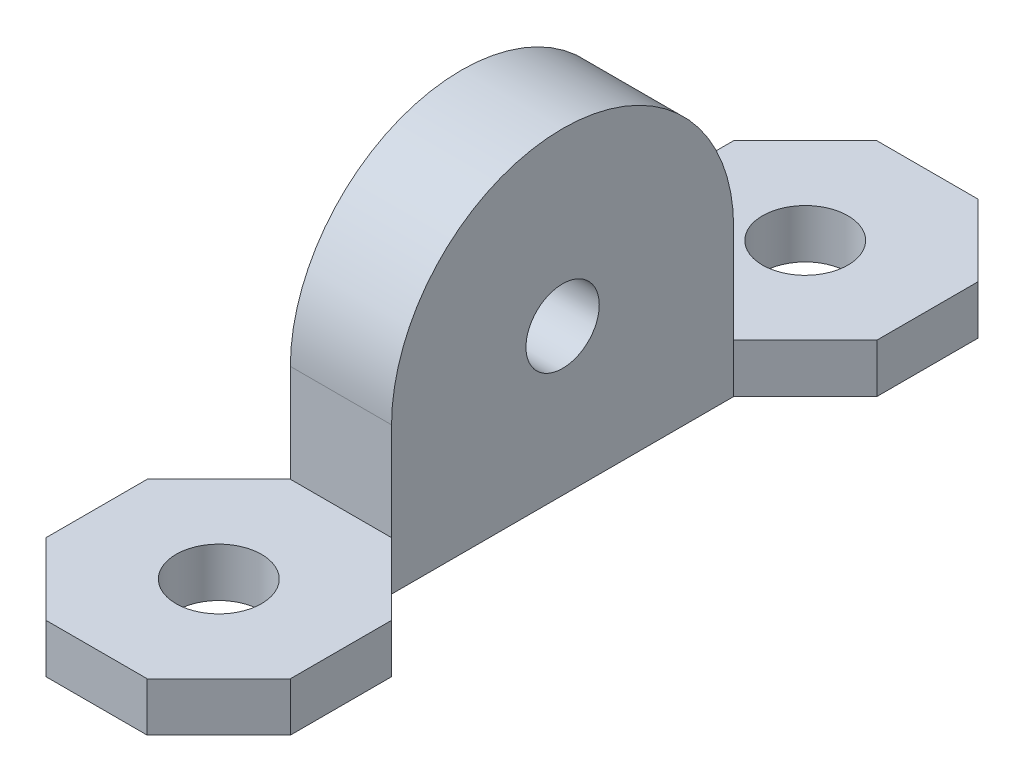
ISO-10303-21;
HEADER;
FILE_DESCRIPTION(('STEP AP214'),'2;1');
FILE_NAME('part.step','',(''),(''),'','','');
FILE_SCHEMA(('AUTOMOTIVE_DESIGN { 1 0 10303 214 1 1 1 1 }'));
ENDSEC;
DATA;
#1=APPLICATION_CONTEXT('core data for automotive mechanical design processes');
#2=APPLICATION_PROTOCOL_DEFINITION('international standard','automotive_design',2000,#1);
#3=PRODUCT_CONTEXT('',#1,'mechanical');
#4=PRODUCT('Part','Part','',(#3));
#5=PRODUCT_RELATED_PRODUCT_CATEGORY('part','',(#4));
#6=PRODUCT_DEFINITION_FORMATION('','',#4);
#7=PRODUCT_DEFINITION_CONTEXT('part definition',#1,'design');
#8=PRODUCT_DEFINITION('design','',#6,#7);
#9=PRODUCT_DEFINITION_SHAPE('','',#8);
#10=(LENGTH_UNIT() NAMED_UNIT(*) SI_UNIT(.MILLI.,.METRE.));
#11=(NAMED_UNIT(*) PLANE_ANGLE_UNIT() SI_UNIT($,.RADIAN.));
#12=(NAMED_UNIT(*) SI_UNIT($,.STERADIAN.) SOLID_ANGLE_UNIT());
#13=UNCERTAINTY_MEASURE_WITH_UNIT(LENGTH_MEASURE(1.E-05),#10,'distance_accuracy_value','');
#14=(GEOMETRIC_REPRESENTATION_CONTEXT(3) GLOBAL_UNCERTAINTY_ASSIGNED_CONTEXT((#13)) GLOBAL_UNIT_ASSIGNED_CONTEXT((#10,
#11,#12)) REPRESENTATION_CONTEXT('',''));
#15=CARTESIAN_POINT('',(0.,0.,0.));
#16=DIRECTION('',(0.,0.,1.));
#17=DIRECTION('',(1.,0.,0.));
#18=AXIS2_PLACEMENT_3D('',#15,#16,#17);
#19=CARTESIAN_POINT('',(0.,2.,0.));
#20=DIRECTION('',(0.,1.,0.));
#21=DIRECTION('',(0.,0.,1.));
#22=AXIS2_PLACEMENT_3D('',#19,#20,#21);
#23=PLANE('',#22);
#24=CARTESIAN_POINT('',(-0.275775290324268,2.,15.722972972973));
#25=DIRECTION('',(0.,1.,0.));
#26=DIRECTION('',(0.,0.,1.));
#27=AXIS2_PLACEMENT_3D('',#24,#25,#26);
#28=CIRCLE('',#27,1.75);
#29=CARTESIAN_POINT('',(-0.275775290324268,2.,17.472972972973));
#30=VERTEX_POINT('',#29);
#31=EDGE_CURVE('E360',#30,#30,#28,.T.);
#32=ORIENTED_EDGE('',*,*,#31,.F.);
#33=EDGE_LOOP('',(#32));
#34=FACE_BOUND('',#33,.T.);
#35=DIRECTION('',(-0.707106781186548,0.,-0.707106781186547));
#36=VECTOR('',#35,1.);
#37=CARTESIAN_POINT('',(4.72422470967573,2.,13.6519051611075));
#38=LINE('',#37,#36);
#39=CARTESIAN_POINT('',(4.72422470967573,2.,13.6519051611075));
#40=VERTEX_POINT('',#39);
#41=CARTESIAN_POINT('',(1.79529252154121,2.,10.722972972973));
#42=VERTEX_POINT('',#41);
#43=EDGE_CURVE('E186',#40,#42,#38,.T.);
#44=ORIENTED_EDGE('',*,*,#43,.T.);
#45=DIRECTION('',(-1.,0.,0.));
#46=VECTOR('',#45,1.);
#47=CARTESIAN_POINT('',(0.,2.,10.722972972973));
#48=LINE('',#47,#46);
#49=CARTESIAN_POINT('',(-2.34684310218974,2.,10.722972972973));
#50=VERTEX_POINT('',#49);
#51=EDGE_CURVE('E169',#42,#50,#48,.T.);
#52=ORIENTED_EDGE('',*,*,#51,.T.);
#53=DIRECTION('',(-0.707106781186548,0.,0.707106781186548));
#54=VECTOR('',#53,1.);
#55=CARTESIAN_POINT('',(-2.34684310218974,2.,10.722972972973));
#56=LINE('',#55,#54);
#57=CARTESIAN_POINT('',(-5.27577529032427,2.,13.6519051611075));
#58=VERTEX_POINT('',#57);
#59=EDGE_CURVE('E216',#50,#58,#56,.T.);
#60=ORIENTED_EDGE('',*,*,#59,.T.);
#61=DIRECTION('',(0.,0.,1.));
#62=VECTOR('',#61,1.);
#63=CARTESIAN_POINT('',(-5.27577529032427,2.,13.6519051611075));
#64=LINE('',#63,#62);
#65=CARTESIAN_POINT('',(-5.27577529032427,2.,17.7940407848384));
#66=VERTEX_POINT('',#65);
#67=EDGE_CURVE('E218',#58,#66,#64,.T.);
#68=ORIENTED_EDGE('',*,*,#67,.T.);
#69=DIRECTION('',(0.707106781186548,0.,0.707106781186547));
#70=VECTOR('',#69,1.);
#71=CARTESIAN_POINT('',(-5.27577529032427,2.,17.7940407848384));
#72=LINE('',#71,#70);
#73=CARTESIAN_POINT('',(-2.34684310218974,2.,20.722972972973));
#74=VERTEX_POINT('',#73);
#75=EDGE_CURVE('E220',#66,#74,#72,.T.);
#76=ORIENTED_EDGE('',*,*,#75,.T.);
#77=DIRECTION('',(1.,0.,0.));
#78=VECTOR('',#77,1.);
#79=CARTESIAN_POINT('',(-2.34684310218974,2.,20.722972972973));
#80=LINE('',#79,#78);
#81=CARTESIAN_POINT('',(1.79529252154121,2.,20.722972972973));
#82=VERTEX_POINT('',#81);
#83=EDGE_CURVE('E222',#74,#82,#80,.T.);
#84=ORIENTED_EDGE('',*,*,#83,.T.);
#85=DIRECTION('',(0.707106781186548,0.,-0.707106781186548));
#86=VECTOR('',#85,1.);
#87=CARTESIAN_POINT('',(1.79529252154121,2.,20.722972972973));
#88=LINE('',#87,#86);
#89=CARTESIAN_POINT('',(4.72422470967573,2.,17.7940407848384));
#90=VERTEX_POINT('',#89);
#91=EDGE_CURVE('E224',#82,#90,#88,.T.);
#92=ORIENTED_EDGE('',*,*,#91,.T.);
#93=DIRECTION('',(0.,0.,-1.));
#94=VECTOR('',#93,1.);
#95=CARTESIAN_POINT('',(4.72422470967573,2.,17.7940407848384));
#96=LINE('',#95,#94);
#97=EDGE_CURVE('E226',#90,#40,#96,.T.);
#98=ORIENTED_EDGE('',*,*,#97,.T.);
#99=EDGE_LOOP('',(#44,#52,#60,#68,#76,#84,#92,#98));
#100=FACE_BOUND('',#99,.T.);
#101=ADVANCED_FACE('F36',(#34,#100),#23,.T.);
#102=CARTESIAN_POINT('',(-0.275775290324269,2.,-8.27702702702704));
#103=DIRECTION('',(0.,1.,0.));
#104=DIRECTION('',(0.,0.,1.));
#105=AXIS2_PLACEMENT_3D('',#102,#103,#104);
#106=CIRCLE('',#105,1.75);
#107=CARTESIAN_POINT('',(-0.275775290324269,2.,-6.52702702702704));
#108=VERTEX_POINT('',#107);
#109=EDGE_CURVE('E354',#108,#108,#106,.T.);
#110=ORIENTED_EDGE('',*,*,#109,.F.);
#111=EDGE_LOOP('',(#110));
#112=FACE_BOUND('',#111,.T.);
#113=DIRECTION('',(0.707106781186548,0.,0.707106781186548));
#114=VECTOR('',#113,1.);
#115=CARTESIAN_POINT('',(-5.27577529032427,2.,-6.20595921516157));
#116=LINE('',#115,#114);
#117=CARTESIAN_POINT('',(-5.27577529032427,2.,-6.20595921516157));
#118=VERTEX_POINT('',#117);
#119=CARTESIAN_POINT('',(-2.34684310218974,2.,-3.27702702702704));
#120=VERTEX_POINT('',#119);
#121=EDGE_CURVE('E163',#118,#120,#116,.T.);
#122=ORIENTED_EDGE('',*,*,#121,.T.);
#123=DIRECTION('',(1.,0.,0.));
#124=VECTOR('',#123,1.);
#125=CARTESIAN_POINT('',(0.,2.,-3.27702702702704));
#126=LINE('',#125,#124);
#127=CARTESIAN_POINT('',(1.79529252154121,2.,-3.27702702702704));
#128=VERTEX_POINT('',#127);
#129=EDGE_CURVE('E157',#120,#128,#126,.T.);
#130=ORIENTED_EDGE('',*,*,#129,.T.);
#131=DIRECTION('',(0.707106781186547,0.,-0.707106781186548));
#132=VECTOR('',#131,1.);
#133=CARTESIAN_POINT('',(1.79529252154121,2.,-3.27702702702704));
#134=LINE('',#133,#132);
#135=CARTESIAN_POINT('',(4.72422470967573,2.,-6.20595921516157));
#136=VERTEX_POINT('',#135);
#137=EDGE_CURVE('E161',#128,#136,#134,.T.);
#138=ORIENTED_EDGE('',*,*,#137,.T.);
#139=DIRECTION('',(0.,0.,-1.));
#140=VECTOR('',#139,1.);
#141=CARTESIAN_POINT('',(4.72422470967573,2.,-6.20595921516157));
#142=LINE('',#141,#140);
#143=CARTESIAN_POINT('',(4.72422470967573,2.,-10.3480948388925));
#144=VERTEX_POINT('',#143);
#145=EDGE_CURVE('E53',#136,#144,#142,.T.);
#146=ORIENTED_EDGE('',*,*,#145,.T.);
#147=DIRECTION('',(-0.707106781186548,0.,-0.707106781186548));
#148=VECTOR('',#147,1.);
#149=CARTESIAN_POINT('',(4.72422470967573,2.,-10.3480948388925));
#150=LINE('',#149,#148);
#151=CARTESIAN_POINT('',(1.79529252154121,2.,-13.277027027027));
#152=VERTEX_POINT('',#151);
#153=EDGE_CURVE('E208',#144,#152,#150,.T.);
#154=ORIENTED_EDGE('',*,*,#153,.T.);
#155=DIRECTION('',(-1.,0.,0.));
#156=VECTOR('',#155,1.);
#157=CARTESIAN_POINT('',(1.79529252154121,2.,-13.277027027027));
#158=LINE('',#157,#156);
#159=CARTESIAN_POINT('',(-2.34684310218974,2.,-13.277027027027));
#160=VERTEX_POINT('',#159);
#161=EDGE_CURVE('E121',#152,#160,#158,.T.);
#162=ORIENTED_EDGE('',*,*,#161,.T.);
#163=DIRECTION('',(-0.707106781186547,0.,0.707106781186548));
#164=VECTOR('',#163,1.);
#165=CARTESIAN_POINT('',(-2.34684310218974,2.,-13.277027027027));
#166=LINE('',#165,#164);
#167=CARTESIAN_POINT('',(-5.27577529032427,2.,-10.3480948388925));
#168=VERTEX_POINT('',#167);
#169=EDGE_CURVE('E211',#160,#168,#166,.T.);
#170=ORIENTED_EDGE('',*,*,#169,.T.);
#171=DIRECTION('',(0.,0.,1.));
#172=VECTOR('',#171,1.);
#173=CARTESIAN_POINT('',(-5.27577529032427,2.,-10.3480948388925));
#174=LINE('',#173,#172);
#175=EDGE_CURVE('E213',#168,#118,#174,.T.);
#176=ORIENTED_EDGE('',*,*,#175,.T.);
#177=EDGE_LOOP('',(#122,#130,#138,#146,#154,#162,#170,#176));
#178=FACE_BOUND('',#177,.T.);
#179=ADVANCED_FACE('F159',(#112,#178),#23,.T.);
#180=CARTESIAN_POINT('',(4.72422470967573,2.,-10.3480948388925));
#181=DIRECTION('',(-0.707106781186547,0.,0.707106781186548));
#182=DIRECTION('',(0.707106781186548,0.,0.707106781186547));
#183=AXIS2_PLACEMENT_3D('',#180,#181,#182);
#184=PLANE('',#183);
#185=DIRECTION('',(-0.707106781186548,0.,-0.707106781186548));
#186=VECTOR('',#185,1.);
#187=CARTESIAN_POINT('',(4.72422470967573,0.,-10.3480948388925));
#188=LINE('',#187,#186);
#189=CARTESIAN_POINT('',(4.72422470967573,0.,-10.3480948388925));
#190=VERTEX_POINT('',#189);
#191=CARTESIAN_POINT('',(1.79529252154121,0.,-13.277027027027));
#192=VERTEX_POINT('',#191);
#193=EDGE_CURVE('E207',#190,#192,#188,.T.);
#194=ORIENTED_EDGE('',*,*,#193,.T.);
#195=DIRECTION('',(0.,-1.,0.));
#196=VECTOR('',#195,1.);
#197=CARTESIAN_POINT('',(1.79529252154121,2.,-13.277027027027));
#198=LINE('',#197,#196);
#199=EDGE_CURVE('E11',#152,#192,#198,.T.);
#200=ORIENTED_EDGE('',*,*,#199,.F.);
#201=ORIENTED_EDGE('',*,*,#153,.F.);
#202=DIRECTION('',(0.,-1.,0.));
#203=VECTOR('',#202,1.);
#204=CARTESIAN_POINT('',(4.72422470967573,2.,-10.3480948388925));
#205=LINE('',#204,#203);
#206=EDGE_CURVE('E230',#144,#190,#205,.T.);
#207=ORIENTED_EDGE('',*,*,#206,.T.);
#208=EDGE_LOOP('',(#194,#200,#201,#207));
#209=FACE_BOUND('',#208,.T.);
#210=ADVANCED_FACE('F38',(#209),#184,.F.);
#211=CARTESIAN_POINT('',(1.79529252154121,2.,-13.277027027027));
#212=DIRECTION('',(0.,0.,1.));
#213=DIRECTION('',(1.,0.,0.));
#214=AXIS2_PLACEMENT_3D('',#211,#212,#213);
#215=PLANE('',#214);
#216=DIRECTION('',(-1.,0.,0.));
#217=VECTOR('',#216,1.);
#218=CARTESIAN_POINT('',(1.79529252154121,0.,-13.277027027027));
#219=LINE('',#218,#217);
#220=CARTESIAN_POINT('',(-2.34684310218974,0.,-13.277027027027));
#221=VERTEX_POINT('',#220);
#222=EDGE_CURVE('E233',#192,#221,#219,.T.);
#223=ORIENTED_EDGE('',*,*,#222,.T.);
#224=DIRECTION('',(0.,-1.,0.));
#225=VECTOR('',#224,1.);
#226=CARTESIAN_POINT('',(-2.34684310218974,2.,-13.277027027027));
#227=LINE('',#226,#225);
#228=EDGE_CURVE('E45',#160,#221,#227,.T.);
#229=ORIENTED_EDGE('',*,*,#228,.F.);
#230=ORIENTED_EDGE('',*,*,#161,.F.);
#231=ORIENTED_EDGE('',*,*,#199,.T.);
#232=EDGE_LOOP('',(#223,#229,#230,#231));
#233=FACE_BOUND('',#232,.T.);
#234=ADVANCED_FACE('F426',(#233),#215,.F.);
#235=CARTESIAN_POINT('',(-2.34684310218974,2.,-13.277027027027));
#236=DIRECTION('',(0.707106781186548,0.,0.707106781186547));
#237=DIRECTION('',(0.707106781186547,0.,-0.707106781186548));
#238=AXIS2_PLACEMENT_3D('',#235,#236,#237);
#239=PLANE('',#238);
#240=DIRECTION('',(-0.707106781186547,0.,0.707106781186548));
#241=VECTOR('',#240,1.);
#242=CARTESIAN_POINT('',(-2.34684310218974,0.,-13.277027027027));
#243=LINE('',#242,#241);
#244=CARTESIAN_POINT('',(-5.27577529032427,0.,-10.3480948388925));
#245=VERTEX_POINT('',#244);
#246=EDGE_CURVE('E235',#221,#245,#243,.T.);
#247=ORIENTED_EDGE('',*,*,#246,.T.);
#248=DIRECTION('',(0.,-1.,0.));
#249=VECTOR('',#248,1.);
#250=CARTESIAN_POINT('',(-5.27577529032427,2.,-10.3480948388925));
#251=LINE('',#250,#249);
#252=EDGE_CURVE('E290',#168,#245,#251,.T.);
#253=ORIENTED_EDGE('',*,*,#252,.F.);
#254=ORIENTED_EDGE('',*,*,#169,.F.);
#255=ORIENTED_EDGE('',*,*,#228,.T.);
#256=EDGE_LOOP('',(#247,#253,#254,#255));
#257=FACE_BOUND('',#256,.T.);
#258=ADVANCED_FACE('F296',(#257),#239,.F.);
#259=CARTESIAN_POINT('',(-5.27577529032427,2.,-10.3480948388925));
#260=DIRECTION('',(1.,0.,0.));
#261=DIRECTION('',(0.,0.,-1.));
#262=AXIS2_PLACEMENT_3D('',#259,#260,#261);
#263=PLANE('',#262);
#264=DIRECTION('',(0.,0.,1.));
#265=VECTOR('',#264,1.);
#266=CARTESIAN_POINT('',(-5.27577529032427,0.,-10.3480948388925));
#267=LINE('',#266,#265);
#268=CARTESIAN_POINT('',(-5.27577529032427,0.,-6.20595921516157));
#269=VERTEX_POINT('',#268);
#270=EDGE_CURVE('E237',#245,#269,#267,.T.);
#271=ORIENTED_EDGE('',*,*,#270,.T.);
#272=DIRECTION('',(0.,-1.,0.));
#273=VECTOR('',#272,1.);
#274=CARTESIAN_POINT('',(-5.27577529032427,2.,-6.20595921516157));
#275=LINE('',#274,#273);
#276=EDGE_CURVE('E287',#118,#269,#275,.T.);
#277=ORIENTED_EDGE('',*,*,#276,.F.);
#278=ORIENTED_EDGE('',*,*,#175,.F.);
#279=ORIENTED_EDGE('',*,*,#252,.T.);
#280=EDGE_LOOP('',(#271,#277,#278,#279));
#281=FACE_BOUND('',#280,.T.);
#282=ADVANCED_FACE('F306',(#281),#263,.F.);
#283=CARTESIAN_POINT('',(-5.27577529032427,2.,-6.20595921516157));
#284=DIRECTION('',(0.707106781186547,0.,-0.707106781186548));
#285=DIRECTION('',(-0.707106781186548,0.,-0.707106781186547));
#286=AXIS2_PLACEMENT_3D('',#283,#284,#285);
#287=PLANE('',#286);
#288=DIRECTION('',(0.707106781186548,0.,0.707106781186548));
#289=VECTOR('',#288,1.);
#290=CARTESIAN_POINT('',(-5.27577529032427,0.,-6.20595921516157));
#291=LINE('',#290,#289);
#292=CARTESIAN_POINT('',(-2.34684310218974,0.,-3.27702702702704));
#293=VERTEX_POINT('',#292);
#294=EDGE_CURVE('E239',#269,#293,#291,.T.);
#295=ORIENTED_EDGE('',*,*,#294,.T.);
#296=DIRECTION('',(0.,-1.,0.));
#297=VECTOR('',#296,1.);
#298=CARTESIAN_POINT('',(-2.34684310218974,2.,-3.27702702702704));
#299=LINE('',#298,#297);
#300=EDGE_CURVE('E284',#120,#293,#299,.T.);
#301=ORIENTED_EDGE('',*,*,#300,.F.);
#302=ORIENTED_EDGE('',*,*,#121,.F.);
#303=ORIENTED_EDGE('',*,*,#276,.T.);
#304=EDGE_LOOP('',(#295,#301,#302,#303));
#305=FACE_BOUND('',#304,.T.);
#306=ADVANCED_FACE('F309',(#305),#287,.F.);
#307=CARTESIAN_POINT('',(-2.34684310218974,2.,-3.27702702702704));
#308=DIRECTION('',(1.,0.,0.));
#309=DIRECTION('',(0.,0.,-1.));
#310=AXIS2_PLACEMENT_3D('',#307,#308,#309);
#311=PLANE('',#310);
#312=CARTESIAN_POINT('',(-2.34684310218974,6.,3.72297297297296));
#313=DIRECTION('',(1.,0.,0.));
#314=DIRECTION('',(0.,0.,-1.));
#315=AXIS2_PLACEMENT_3D('',#312,#313,#314);
#316=CIRCLE('',#315,1.5);
#317=CARTESIAN_POINT('',(-2.34684310218974,6.,2.22297297297296));
#318=VERTEX_POINT('',#317);
#319=EDGE_CURVE('E345',#318,#318,#316,.T.);
#320=ORIENTED_EDGE('',*,*,#319,.T.);
#321=EDGE_LOOP('',(#320));
#322=FACE_BOUND('',#321,.T.);
#323=DIRECTION('',(0.,0.,1.));
#324=VECTOR('',#323,1.);
#325=CARTESIAN_POINT('',(-2.34684310218974,0.,-3.27702702702704));
#326=LINE('',#325,#324);
#327=CARTESIAN_POINT('',(-2.34684310218974,0.,10.722972972973));
#328=VERTEX_POINT('',#327);
#329=EDGE_CURVE('E241',#293,#328,#326,.T.);
#330=ORIENTED_EDGE('',*,*,#329,.T.);
#331=DIRECTION('',(0.,-1.,0.));
#332=VECTOR('',#331,1.);
#333=CARTESIAN_POINT('',(-2.34684310218974,2.,10.722972972973));
#334=LINE('',#333,#332);
#335=EDGE_CURVE('E281',#50,#328,#334,.T.);
#336=ORIENTED_EDGE('',*,*,#335,.F.);
#337=DIRECTION('',(0.,1.,0.));
#338=VECTOR('',#337,1.);
#339=CARTESIAN_POINT('',(-2.34684310218974,0.,10.722972972973));
#340=LINE('',#339,#338);
#341=CARTESIAN_POINT('',(-2.34684310218974,6.,10.722972972973));
#342=VERTEX_POINT('',#341);
#343=EDGE_CURVE('E332',#50,#342,#340,.T.);
#344=ORIENTED_EDGE('',*,*,#343,.T.);
#345=CARTESIAN_POINT('',(-2.34684310218974,6.,3.72297297297296));
#346=DIRECTION('',(1.,0.,0.));
#347=DIRECTION('',(0.,0.,-1.));
#348=AXIS2_PLACEMENT_3D('',#345,#346,#347);
#349=CIRCLE('',#348,7.);
#350=CARTESIAN_POINT('',(-2.34684310218974,6.,-3.27702702702704));
#351=VERTEX_POINT('',#350);
#352=EDGE_CURVE('E335',#342,#351,#349,.F.);
#353=ORIENTED_EDGE('',*,*,#352,.T.);
#354=DIRECTION('',(0.,-1.,0.));
#355=VECTOR('',#354,1.);
#356=CARTESIAN_POINT('',(-2.34684310218974,6.,-3.27702702702704));
#357=LINE('',#356,#355);
#358=EDGE_CURVE('E201',#351,#120,#357,.T.);
#359=ORIENTED_EDGE('',*,*,#358,.T.);
#360=ORIENTED_EDGE('',*,*,#300,.T.);
#361=EDGE_LOOP('',(#330,#336,#344,#353,#359,#360));
#362=FACE_BOUND('',#361,.T.);
#363=ADVANCED_FACE('F311',(#322,#362),#311,.F.);
#364=CARTESIAN_POINT('',(-2.34684310218974,2.,10.722972972973));
#365=DIRECTION('',(0.707106781186547,0.,0.707106781186548));
#366=DIRECTION('',(0.707106781186548,0.,-0.707106781186547));
#367=AXIS2_PLACEMENT_3D('',#364,#365,#366);
#368=PLANE('',#367);
#369=DIRECTION('',(-0.707106781186548,0.,0.707106781186548));
#370=VECTOR('',#369,1.);
#371=CARTESIAN_POINT('',(-2.34684310218974,0.,10.722972972973));
#372=LINE('',#371,#370);
#373=CARTESIAN_POINT('',(-5.27577529032427,0.,13.6519051611075));
#374=VERTEX_POINT('',#373);
#375=EDGE_CURVE('E243',#328,#374,#372,.T.);
#376=ORIENTED_EDGE('',*,*,#375,.T.);
#377=DIRECTION('',(0.,-1.,0.));
#378=VECTOR('',#377,1.);
#379=CARTESIAN_POINT('',(-5.27577529032427,2.,13.6519051611075));
#380=LINE('',#379,#378);
#381=EDGE_CURVE('E278',#58,#374,#380,.T.);
#382=ORIENTED_EDGE('',*,*,#381,.F.);
#383=ORIENTED_EDGE('',*,*,#59,.F.);
#384=ORIENTED_EDGE('',*,*,#335,.T.);
#385=EDGE_LOOP('',(#376,#382,#383,#384));
#386=FACE_BOUND('',#385,.T.);
#387=ADVANCED_FACE('F319',(#386),#368,.F.);
#388=CARTESIAN_POINT('',(-5.27577529032427,2.,13.6519051611075));
#389=DIRECTION('',(1.,0.,0.));
#390=DIRECTION('',(0.,0.,-1.));
#391=AXIS2_PLACEMENT_3D('',#388,#389,#390);
#392=PLANE('',#391);
#393=DIRECTION('',(0.,0.,1.));
#394=VECTOR('',#393,1.);
#395=CARTESIAN_POINT('',(-5.27577529032427,0.,13.6519051611075));
#396=LINE('',#395,#394);
#397=CARTESIAN_POINT('',(-5.27577529032427,0.,17.7940407848384));
#398=VERTEX_POINT('',#397);
#399=EDGE_CURVE('E245',#374,#398,#396,.T.);
#400=ORIENTED_EDGE('',*,*,#399,.T.);
#401=DIRECTION('',(0.,-1.,0.));
#402=VECTOR('',#401,1.);
#403=CARTESIAN_POINT('',(-5.27577529032427,2.,17.7940407848384));
#404=LINE('',#403,#402);
#405=EDGE_CURVE('E275',#66,#398,#404,.T.);
#406=ORIENTED_EDGE('',*,*,#405,.F.);
#407=ORIENTED_EDGE('',*,*,#67,.F.);
#408=ORIENTED_EDGE('',*,*,#381,.T.);
#409=EDGE_LOOP('',(#400,#406,#407,#408));
#410=FACE_BOUND('',#409,.T.);
#411=ADVANCED_FACE('F323',(#410),#392,.F.);
#412=CARTESIAN_POINT('',(-5.27577529032427,2.,17.7940407848384));
#413=DIRECTION('',(0.707106781186547,0.,-0.707106781186548));
#414=DIRECTION('',(-0.707106781186548,0.,-0.707106781186547));
#415=AXIS2_PLACEMENT_3D('',#412,#413,#414);
#416=PLANE('',#415);
#417=DIRECTION('',(0.707106781186548,0.,0.707106781186547));
#418=VECTOR('',#417,1.);
#419=CARTESIAN_POINT('',(-5.27577529032427,0.,17.7940407848384));
#420=LINE('',#419,#418);
#421=CARTESIAN_POINT('',(-2.34684310218974,0.,20.722972972973));
#422=VERTEX_POINT('',#421);
#423=EDGE_CURVE('E247',#398,#422,#420,.T.);
#424=ORIENTED_EDGE('',*,*,#423,.T.);
#425=DIRECTION('',(0.,-1.,0.));
#426=VECTOR('',#425,1.);
#427=CARTESIAN_POINT('',(-2.34684310218974,2.,20.722972972973));
#428=LINE('',#427,#426);
#429=EDGE_CURVE('E272',#74,#422,#428,.T.);
#430=ORIENTED_EDGE('',*,*,#429,.F.);
#431=ORIENTED_EDGE('',*,*,#75,.F.);
#432=ORIENTED_EDGE('',*,*,#405,.T.);
#433=EDGE_LOOP('',(#424,#430,#431,#432));
#434=FACE_BOUND('',#433,.T.);
#435=ADVANCED_FACE('F409',(#434),#416,.F.);
#436=CARTESIAN_POINT('',(-2.34684310218974,2.,20.722972972973));
#437=DIRECTION('',(0.,0.,-1.));
#438=DIRECTION('',(-1.,0.,0.));
#439=AXIS2_PLACEMENT_3D('',#436,#437,#438);
#440=PLANE('',#439);
#441=DIRECTION('',(1.,0.,0.));
#442=VECTOR('',#441,1.);
#443=CARTESIAN_POINT('',(-2.34684310218974,0.,20.722972972973));
#444=LINE('',#443,#442);
#445=CARTESIAN_POINT('',(1.79529252154121,0.,20.722972972973));
#446=VERTEX_POINT('',#445);
#447=EDGE_CURVE('E249',#422,#446,#444,.T.);
#448=ORIENTED_EDGE('',*,*,#447,.T.);
#449=DIRECTION('',(0.,-1.,0.));
#450=VECTOR('',#449,1.);
#451=CARTESIAN_POINT('',(1.79529252154121,2.,20.722972972973));
#452=LINE('',#451,#450);
#453=EDGE_CURVE('E269',#82,#446,#452,.T.);
#454=ORIENTED_EDGE('',*,*,#453,.F.);
#455=ORIENTED_EDGE('',*,*,#83,.F.);
#456=ORIENTED_EDGE('',*,*,#429,.T.);
#457=EDGE_LOOP('',(#448,#454,#455,#456));
#458=FACE_BOUND('',#457,.T.);
#459=ADVANCED_FACE('F405',(#458),#440,.F.);
#460=CARTESIAN_POINT('',(1.79529252154121,2.,20.722972972973));
#461=DIRECTION('',(-0.707106781186547,0.,-0.707106781186547));
#462=DIRECTION('',(-0.707106781186548,0.,0.707106781186548));
#463=AXIS2_PLACEMENT_3D('',#460,#461,#462);
#464=PLANE('',#463);
#465=DIRECTION('',(0.707106781186548,0.,-0.707106781186548));
#466=VECTOR('',#465,1.);
#467=CARTESIAN_POINT('',(1.79529252154121,0.,20.722972972973));
#468=LINE('',#467,#466);
#469=CARTESIAN_POINT('',(4.72422470967573,0.,17.7940407848384));
#470=VERTEX_POINT('',#469);
#471=EDGE_CURVE('E251',#446,#470,#468,.T.);
#472=ORIENTED_EDGE('',*,*,#471,.T.);
#473=DIRECTION('',(0.,-1.,0.));
#474=VECTOR('',#473,1.);
#475=CARTESIAN_POINT('',(4.72422470967573,2.,17.7940407848384));
#476=LINE('',#475,#474);
#477=EDGE_CURVE('E266',#90,#470,#476,.T.);
#478=ORIENTED_EDGE('',*,*,#477,.F.);
#479=ORIENTED_EDGE('',*,*,#91,.F.);
#480=ORIENTED_EDGE('',*,*,#453,.T.);
#481=EDGE_LOOP('',(#472,#478,#479,#480));
#482=FACE_BOUND('',#481,.T.);
#483=ADVANCED_FACE('F401',(#482),#464,.F.);
#484=CARTESIAN_POINT('',(4.72422470967573,2.,17.7940407848384));
#485=DIRECTION('',(-1.,0.,0.));
#486=DIRECTION('',(0.,0.,1.));
#487=AXIS2_PLACEMENT_3D('',#484,#485,#486);
#488=PLANE('',#487);
#489=DIRECTION('',(0.,0.,-1.));
#490=VECTOR('',#489,1.);
#491=CARTESIAN_POINT('',(4.72422470967573,0.,17.7940407848384));
#492=LINE('',#491,#490);
#493=CARTESIAN_POINT('',(4.72422470967573,0.,13.6519051611075));
#494=VERTEX_POINT('',#493);
#495=EDGE_CURVE('E253',#470,#494,#492,.T.);
#496=ORIENTED_EDGE('',*,*,#495,.T.);
#497=DIRECTION('',(0.,-1.,0.));
#498=VECTOR('',#497,1.);
#499=CARTESIAN_POINT('',(4.72422470967573,2.,13.6519051611075));
#500=LINE('',#499,#498);
#501=EDGE_CURVE('E263',#40,#494,#500,.T.);
#502=ORIENTED_EDGE('',*,*,#501,.F.);
#503=ORIENTED_EDGE('',*,*,#97,.F.);
#504=ORIENTED_EDGE('',*,*,#477,.T.);
#505=EDGE_LOOP('',(#496,#502,#503,#504));
#506=FACE_BOUND('',#505,.T.);
#507=ADVANCED_FACE('F397',(#506),#488,.F.);
#508=CARTESIAN_POINT('',(4.72422470967573,2.,13.6519051611075));
#509=DIRECTION('',(-0.707106781186547,0.,0.707106781186548));
#510=DIRECTION('',(0.707106781186548,0.,0.707106781186547));
#511=AXIS2_PLACEMENT_3D('',#508,#509,#510);
#512=PLANE('',#511);
#513=DIRECTION('',(-0.707106781186548,0.,-0.707106781186547));
#514=VECTOR('',#513,1.);
#515=CARTESIAN_POINT('',(4.72422470967573,0.,13.6519051611075));
#516=LINE('',#515,#514);
#517=CARTESIAN_POINT('',(1.79529252154121,0.,10.722972972973));
#518=VERTEX_POINT('',#517);
#519=EDGE_CURVE('E255',#494,#518,#516,.T.);
#520=ORIENTED_EDGE('',*,*,#519,.T.);
#521=DIRECTION('',(0.,-1.,0.));
#522=VECTOR('',#521,1.);
#523=CARTESIAN_POINT('',(1.79529252154121,2.,10.722972972973));
#524=LINE('',#523,#522);
#525=EDGE_CURVE('E182',#42,#518,#524,.T.);
#526=ORIENTED_EDGE('',*,*,#525,.F.);
#527=ORIENTED_EDGE('',*,*,#43,.F.);
#528=ORIENTED_EDGE('',*,*,#501,.T.);
#529=EDGE_LOOP('',(#520,#526,#527,#528));
#530=FACE_BOUND('',#529,.T.);
#531=ADVANCED_FACE('F393',(#530),#512,.F.);
#532=CARTESIAN_POINT('',(1.79529252154121,2.,10.722972972973));
#533=DIRECTION('',(-1.,0.,0.));
#534=DIRECTION('',(0.,0.,1.));
#535=AXIS2_PLACEMENT_3D('',#532,#533,#534);
#536=PLANE('',#535);
#537=CARTESIAN_POINT('',(1.79529252154121,6.,3.72297297297296));
#538=DIRECTION('',(1.,0.,0.));
#539=DIRECTION('',(0.,0.,-1.));
#540=AXIS2_PLACEMENT_3D('',#537,#538,#539);
#541=CIRCLE('',#540,1.5);
#542=CARTESIAN_POINT('',(1.79529252154121,6.,2.22297297297296));
#543=VERTEX_POINT('',#542);
#544=EDGE_CURVE('E348',#543,#543,#541,.T.);
#545=ORIENTED_EDGE('',*,*,#544,.F.);
#546=EDGE_LOOP('',(#545));
#547=FACE_BOUND('',#546,.T.);
#548=DIRECTION('',(0.,0.,-1.));
#549=VECTOR('',#548,1.);
#550=CARTESIAN_POINT('',(1.79529252154121,0.,10.722972972973));
#551=LINE('',#550,#549);
#552=CARTESIAN_POINT('',(1.79529252154121,0.,-3.27702702702704));
#553=VERTEX_POINT('',#552);
#554=EDGE_CURVE('E181',#518,#553,#551,.T.);
#555=ORIENTED_EDGE('',*,*,#554,.T.);
#556=DIRECTION('',(0.,-1.,0.));
#557=VECTOR('',#556,1.);
#558=CARTESIAN_POINT('',(1.79529252154121,2.,-3.27702702702704));
#559=LINE('',#558,#557);
#560=EDGE_CURVE('E174',#128,#553,#559,.T.);
#561=ORIENTED_EDGE('',*,*,#560,.F.);
#562=DIRECTION('',(0.,-1.,0.));
#563=VECTOR('',#562,1.);
#564=CARTESIAN_POINT('',(1.79529252154121,6.,-3.27702702702704));
#565=LINE('',#564,#563);
#566=CARTESIAN_POINT('',(1.79529252154121,6.,-3.27702702702704));
#567=VERTEX_POINT('',#566);
#568=EDGE_CURVE('E170',#567,#128,#565,.T.);
#569=ORIENTED_EDGE('',*,*,#568,.F.);
#570=CARTESIAN_POINT('',(1.79529252154121,6.,3.72297297297296));
#571=DIRECTION('',(-1.,0.,0.));
#572=DIRECTION('',(0.,0.,1.));
#573=AXIS2_PLACEMENT_3D('',#570,#571,#572);
#574=CIRCLE('',#573,7.);
#575=CARTESIAN_POINT('',(1.79529252154121,6.,10.722972972973));
#576=VERTEX_POINT('',#575);
#577=EDGE_CURVE('E192',#576,#567,#574,.T.);
#578=ORIENTED_EDGE('',*,*,#577,.F.);
#579=DIRECTION('',(0.,1.,0.));
#580=VECTOR('',#579,1.);
#581=CARTESIAN_POINT('',(1.79529252154121,0.,10.722972972973));
#582=LINE('',#581,#580);
#583=EDGE_CURVE('E194',#42,#576,#582,.T.);
#584=ORIENTED_EDGE('',*,*,#583,.F.);
#585=ORIENTED_EDGE('',*,*,#525,.T.);
#586=EDGE_LOOP('',(#555,#561,#569,#578,#584,#585));
#587=FACE_BOUND('',#586,.T.);
#588=ADVANCED_FACE('F175',(#547,#587),#536,.F.);
#589=CARTESIAN_POINT('',(1.79529252154121,2.,-3.27702702702704));
#590=DIRECTION('',(-0.707106781186548,0.,-0.707106781186547));
#591=DIRECTION('',(-0.707106781186547,0.,0.707106781186548));
#592=AXIS2_PLACEMENT_3D('',#589,#590,#591);
#593=PLANE('',#592);
#594=DIRECTION('',(0.707106781186547,0.,-0.707106781186548));
#595=VECTOR('',#594,1.);
#596=CARTESIAN_POINT('',(1.79529252154121,0.,-3.27702702702704));
#597=LINE('',#596,#595);
#598=CARTESIAN_POINT('',(4.72422470967573,0.,-6.20595921516157));
#599=VERTEX_POINT('',#598);
#600=EDGE_CURVE('E107',#553,#599,#597,.T.);
#601=ORIENTED_EDGE('',*,*,#600,.T.);
#602=DIRECTION('',(0.,-1.,0.));
#603=VECTOR('',#602,1.);
#604=CARTESIAN_POINT('',(4.72422470967573,2.,-6.20595921516157));
#605=LINE('',#604,#603);
#606=EDGE_CURVE('E183',#136,#599,#605,.T.);
#607=ORIENTED_EDGE('',*,*,#606,.F.);
#608=ORIENTED_EDGE('',*,*,#137,.F.);
#609=ORIENTED_EDGE('',*,*,#560,.T.);
#610=EDGE_LOOP('',(#601,#607,#608,#609));
#611=FACE_BOUND('',#610,.T.);
#612=ADVANCED_FACE('F185',(#611),#593,.F.);
#613=CARTESIAN_POINT('',(4.72422470967573,2.,-6.20595921516157));
#614=DIRECTION('',(-1.,0.,0.));
#615=DIRECTION('',(0.,0.,1.));
#616=AXIS2_PLACEMENT_3D('',#613,#614,#615);
#617=PLANE('',#616);
#618=DIRECTION('',(0.,0.,-1.));
#619=VECTOR('',#618,1.);
#620=CARTESIAN_POINT('',(4.72422470967573,0.,-6.20595921516157));
#621=LINE('',#620,#619);
#622=EDGE_CURVE('E113',#599,#190,#621,.T.);
#623=ORIENTED_EDGE('',*,*,#622,.T.);
#624=ORIENTED_EDGE('',*,*,#206,.F.);
#625=ORIENTED_EDGE('',*,*,#145,.F.);
#626=ORIENTED_EDGE('',*,*,#606,.T.);
#627=EDGE_LOOP('',(#623,#624,#625,#626));
#628=FACE_BOUND('',#627,.T.);
#629=ADVANCED_FACE('F386',(#628),#617,.F.);
#630=CARTESIAN_POINT('',(0.,0.,0.));
#631=DIRECTION('',(0.,1.,0.));
#632=DIRECTION('',(0.,0.,1.));
#633=AXIS2_PLACEMENT_3D('',#630,#631,#632);
#634=PLANE('',#633);
#635=CARTESIAN_POINT('',(-0.275775290324268,0.,15.722972972973));
#636=DIRECTION('',(0.,1.,0.));
#637=DIRECTION('',(0.,0.,1.));
#638=AXIS2_PLACEMENT_3D('',#635,#636,#637);
#639=CIRCLE('',#638,1.75);
#640=CARTESIAN_POINT('',(-0.275775290324268,0.,17.472972972973));
#641=VERTEX_POINT('',#640);
#642=EDGE_CURVE('E353',#641,#641,#639,.T.);
#643=ORIENTED_EDGE('',*,*,#642,.T.);
#644=EDGE_LOOP('',(#643));
#645=FACE_BOUND('',#644,.T.);
#646=CARTESIAN_POINT('',(-0.275775290324269,0.,-8.27702702702704));
#647=DIRECTION('',(0.,1.,0.));
#648=DIRECTION('',(0.,0.,1.));
#649=AXIS2_PLACEMENT_3D('',#646,#647,#648);
#650=CIRCLE('',#649,1.75);
#651=CARTESIAN_POINT('',(-0.275775290324269,0.,-6.52702702702704));
#652=VERTEX_POINT('',#651);
#653=EDGE_CURVE('E357',#652,#652,#650,.T.);
#654=ORIENTED_EDGE('',*,*,#653,.T.);
#655=EDGE_LOOP('',(#654));
#656=FACE_BOUND('',#655,.T.);
#657=ORIENTED_EDGE('',*,*,#554,.F.);
#658=ORIENTED_EDGE('',*,*,#519,.F.);
#659=ORIENTED_EDGE('',*,*,#495,.F.);
#660=ORIENTED_EDGE('',*,*,#471,.F.);
#661=ORIENTED_EDGE('',*,*,#447,.F.);
#662=ORIENTED_EDGE('',*,*,#423,.F.);
#663=ORIENTED_EDGE('',*,*,#399,.F.);
#664=ORIENTED_EDGE('',*,*,#375,.F.);
#665=ORIENTED_EDGE('',*,*,#329,.F.);
#666=ORIENTED_EDGE('',*,*,#294,.F.);
#667=ORIENTED_EDGE('',*,*,#270,.F.);
#668=ORIENTED_EDGE('',*,*,#246,.F.);
#669=ORIENTED_EDGE('',*,*,#222,.F.);
#670=ORIENTED_EDGE('',*,*,#193,.F.);
#671=ORIENTED_EDGE('',*,*,#622,.F.);
#672=ORIENTED_EDGE('',*,*,#600,.F.);
#673=EDGE_LOOP('',(#657,#658,#659,#660,#661,#662,#663,#664,#665,#666,#667,#668,#669,#670,#671,#672));
#674=FACE_BOUND('',#673,.T.);
#675=ADVANCED_FACE('F300',(#645,#656,#674),#634,.F.);
#676=CARTESIAN_POINT('',(20.900265696084,0.,10.722972972973));
#677=DIRECTION('',(0.,0.,-1.));
#678=DIRECTION('',(-1.,0.,0.));
#679=AXIS2_PLACEMENT_3D('',#676,#677,#678);
#680=PLANE('',#679);
#681=ORIENTED_EDGE('',*,*,#51,.F.);
#682=ORIENTED_EDGE('',*,*,#583,.T.);
#683=DIRECTION('',(-1.,0.,0.));
#684=VECTOR('',#683,1.);
#685=CARTESIAN_POINT('',(20.900265696084,6.,10.722972972973));
#686=LINE('',#685,#684);
#687=EDGE_CURVE('E198',#576,#342,#686,.T.);
#688=ORIENTED_EDGE('',*,*,#687,.T.);
#689=ORIENTED_EDGE('',*,*,#343,.F.);
#690=EDGE_LOOP('',(#681,#682,#688,#689));
#691=FACE_BOUND('',#690,.T.);
#692=ADVANCED_FACE('F341',(#691),#680,.F.);
#693=CARTESIAN_POINT('',(20.900265696084,6.,3.72297297297296));
#694=DIRECTION('',(-1.,0.,0.));
#695=DIRECTION('',(0.,0.,1.));
#696=AXIS2_PLACEMENT_3D('',#693,#694,#695);
#697=CYLINDRICAL_SURFACE('',#696,7.);
#698=ORIENTED_EDGE('',*,*,#687,.F.);
#699=ORIENTED_EDGE('',*,*,#577,.T.);
#700=DIRECTION('',(-1.,0.,0.));
#701=VECTOR('',#700,1.);
#702=CARTESIAN_POINT('',(20.900265696084,6.,-3.27702702702704));
#703=LINE('',#702,#701);
#704=EDGE_CURVE('E190',#567,#351,#703,.T.);
#705=ORIENTED_EDGE('',*,*,#704,.T.);
#706=ORIENTED_EDGE('',*,*,#352,.F.);
#707=EDGE_LOOP('',(#698,#699,#705,#706));
#708=FACE_BOUND('',#707,.T.);
#709=ADVANCED_FACE('F344',(#708),#697,.T.);
#710=CARTESIAN_POINT('',(20.900265696084,6.,-3.27702702702704));
#711=DIRECTION('',(0.,0.,1.));
#712=DIRECTION('',(1.,0.,0.));
#713=AXIS2_PLACEMENT_3D('',#710,#711,#712);
#714=PLANE('',#713);
#715=ORIENTED_EDGE('',*,*,#129,.F.);
#716=ORIENTED_EDGE('',*,*,#358,.F.);
#717=ORIENTED_EDGE('',*,*,#704,.F.);
#718=ORIENTED_EDGE('',*,*,#568,.T.);
#719=EDGE_LOOP('',(#715,#716,#717,#718));
#720=FACE_BOUND('',#719,.T.);
#721=ADVANCED_FACE('F188',(#720),#714,.F.);
#722=CARTESIAN_POINT('',(-5.27577529032427,6.,3.72297297297296));
#723=DIRECTION('',(1.,0.,0.));
#724=DIRECTION('',(0.,0.,-1.));
#725=AXIS2_PLACEMENT_3D('',#722,#723,#724);
#726=CYLINDRICAL_SURFACE('',#725,1.5);
#727=ORIENTED_EDGE('',*,*,#544,.T.);
#728=EDGE_LOOP('',(#727));
#729=FACE_BOUND('',#728,.T.);
#730=ORIENTED_EDGE('',*,*,#319,.F.);
#731=EDGE_LOOP('',(#730));
#732=FACE_BOUND('',#731,.T.);
#733=ADVANCED_FACE('F474',(#729,#732),#726,.F.);
#734=CARTESIAN_POINT('',(-0.275775290324269,0.,-8.27702702702704));
#735=DIRECTION('',(0.,1.,0.));
#736=DIRECTION('',(0.,0.,1.));
#737=AXIS2_PLACEMENT_3D('',#734,#735,#736);
#738=CYLINDRICAL_SURFACE('',#737,1.75);
#739=ORIENTED_EDGE('',*,*,#653,.F.);
#740=EDGE_LOOP('',(#739));
#741=FACE_BOUND('',#740,.T.);
#742=ORIENTED_EDGE('',*,*,#109,.T.);
#743=EDGE_LOOP('',(#742));
#744=FACE_BOUND('',#743,.T.);
#745=ADVANCED_FACE('F371',(#741,#744),#738,.F.);
#746=CARTESIAN_POINT('',(-0.275775290324268,0.,15.722972972973));
#747=DIRECTION('',(0.,1.,0.));
#748=DIRECTION('',(0.,0.,1.));
#749=AXIS2_PLACEMENT_3D('',#746,#747,#748);
#750=CYLINDRICAL_SURFACE('',#749,1.75);
#751=ORIENTED_EDGE('',*,*,#642,.F.);
#752=EDGE_LOOP('',(#751));
#753=FACE_BOUND('',#752,.T.);
#754=ORIENTED_EDGE('',*,*,#31,.T.);
#755=EDGE_LOOP('',(#754));
#756=FACE_BOUND('',#755,.T.);
#757=ADVANCED_FACE('F368',(#753,#756),#750,.F.);
#758=CLOSED_SHELL('',(#101,#179,#210,#234,#258,#282,#306,#363,#387,#411,#435,#459,#483,#507,
#531,#588,#612,#629,#675,#692,#709,#721,#733,#745,#757));
#759=MANIFOLD_SOLID_BREP('B2',#758);
#760=ADVANCED_BREP_SHAPE_REPRESENTATION('',(#18,#759),#14);
#761=SHAPE_DEFINITION_REPRESENTATION(#9,#760);
ENDSEC;
END-ISO-10303-21;
